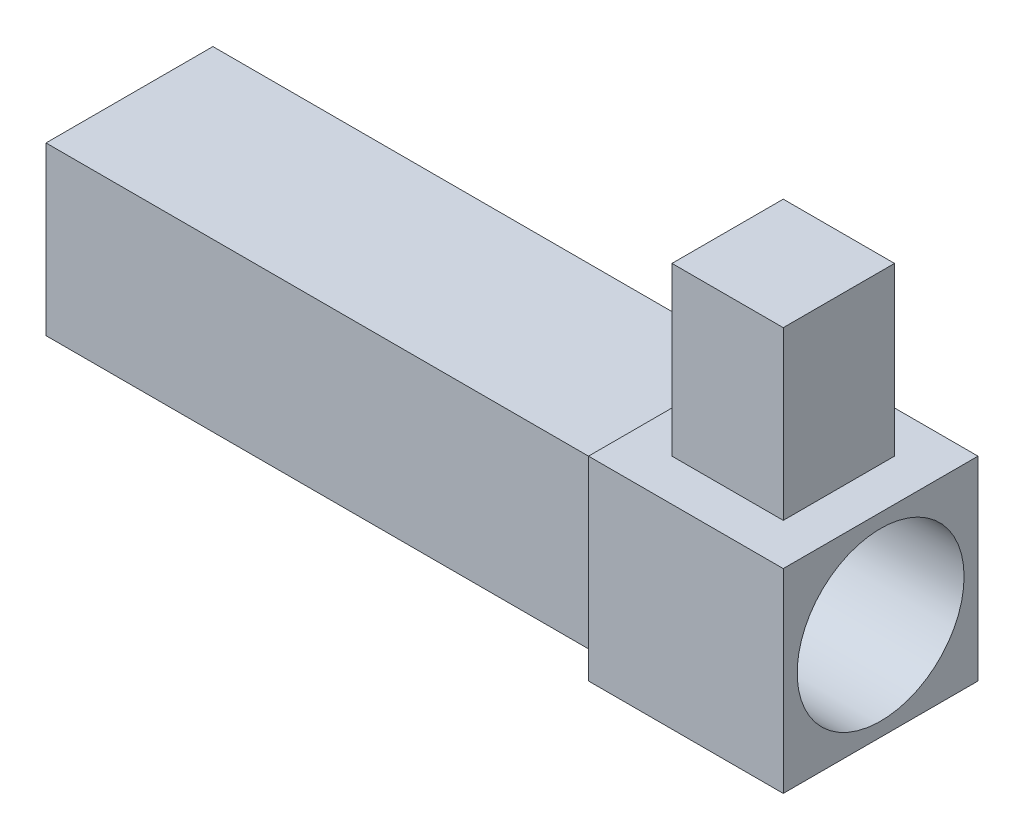
ISO-10303-21;
HEADER;
FILE_DESCRIPTION(('STEP AP214'),'2;1');
FILE_NAME('part.step','',(''),(''),'','','');
FILE_SCHEMA(('AUTOMOTIVE_DESIGN { 1 0 10303 214 1 1 1 1 }'));
ENDSEC;
DATA;
#1=APPLICATION_CONTEXT('core data for automotive mechanical design processes');
#2=APPLICATION_PROTOCOL_DEFINITION('international standard','automotive_design',2000,#1);
#3=PRODUCT_CONTEXT('',#1,'mechanical');
#4=PRODUCT('Part','Part','',(#3));
#5=PRODUCT_RELATED_PRODUCT_CATEGORY('part','',(#4));
#6=PRODUCT_DEFINITION_FORMATION('','',#4);
#7=PRODUCT_DEFINITION_CONTEXT('part definition',#1,'design');
#8=PRODUCT_DEFINITION('design','',#6,#7);
#9=PRODUCT_DEFINITION_SHAPE('','',#8);
#10=(LENGTH_UNIT() NAMED_UNIT(*) SI_UNIT(.MILLI.,.METRE.));
#11=(NAMED_UNIT(*) PLANE_ANGLE_UNIT() SI_UNIT($,.RADIAN.));
#12=(NAMED_UNIT(*) SI_UNIT($,.STERADIAN.) SOLID_ANGLE_UNIT());
#13=UNCERTAINTY_MEASURE_WITH_UNIT(LENGTH_MEASURE(1.E-05),#10,'distance_accuracy_value','');
#14=(GEOMETRIC_REPRESENTATION_CONTEXT(3) GLOBAL_UNCERTAINTY_ASSIGNED_CONTEXT((#13)) GLOBAL_UNIT_ASSIGNED_CONTEXT((#10,
#11,#12)) REPRESENTATION_CONTEXT('',''));
#15=CARTESIAN_POINT('',(0.,0.,0.));
#16=DIRECTION('',(0.,0.,1.));
#17=DIRECTION('',(1.,0.,0.));
#18=AXIS2_PLACEMENT_3D('',#15,#16,#17);
#19=CARTESIAN_POINT('',(135.,17.5,17.5));
#20=DIRECTION('',(0.,-1.,0.));
#21=DIRECTION('',(0.,0.,-1.));
#22=AXIS2_PLACEMENT_3D('',#19,#20,#21);
#23=PLANE('',#22);
#24=DIRECTION('',(0.,0.,1.));
#25=VECTOR('',#24,1.);
#26=CARTESIAN_POINT('',(100.,17.5,17.5));
#27=LINE('',#26,#25);
#28=CARTESIAN_POINT('',(100.,17.5,-17.5));
#29=VERTEX_POINT('',#28);
#30=CARTESIAN_POINT('',(100.,17.5,17.5));
#31=VERTEX_POINT('',#30);
#32=EDGE_CURVE('E173',#29,#31,#27,.T.);
#33=ORIENTED_EDGE('',*,*,#32,.T.);
#34=DIRECTION('',(-1.,0.,0.));
#35=VECTOR('',#34,1.);
#36=CARTESIAN_POINT('',(135.,17.5,17.5));
#37=LINE('',#36,#35);
#38=CARTESIAN_POINT('',(135.,17.5,17.5));
#39=VERTEX_POINT('',#38);
#40=EDGE_CURVE('E183',#39,#31,#37,.T.);
#41=ORIENTED_EDGE('',*,*,#40,.F.);
#42=DIRECTION('',(0.,0.,1.));
#43=VECTOR('',#42,1.);
#44=CARTESIAN_POINT('',(135.,17.5,17.5));
#45=LINE('',#44,#43);
#46=CARTESIAN_POINT('',(135.,17.5,-17.5));
#47=VERTEX_POINT('',#46);
#48=EDGE_CURVE('E163',#47,#39,#45,.T.);
#49=ORIENTED_EDGE('',*,*,#48,.F.);
#50=DIRECTION('',(-1.,0.,0.));
#51=VECTOR('',#50,1.);
#52=CARTESIAN_POINT('',(135.,17.5,-17.5));
#53=LINE('',#52,#51);
#54=EDGE_CURVE('E186',#47,#29,#53,.T.);
#55=ORIENTED_EDGE('',*,*,#54,.T.);
#56=EDGE_LOOP('',(#33,#41,#49,#55));
#57=FACE_BOUND('',#56,.T.);
#58=DIRECTION('',(0.,0.,-1.));
#59=VECTOR('',#58,1.);
#60=CARTESIAN_POINT('',(127.5,17.5,-10.));
#61=LINE('',#60,#59);
#62=CARTESIAN_POINT('',(127.5,17.5,9.99999999999999));
#63=VERTEX_POINT('',#62);
#64=CARTESIAN_POINT('',(127.5,17.5,-10.));
#65=VERTEX_POINT('',#64);
#66=EDGE_CURVE('E54',#63,#65,#61,.T.);
#67=ORIENTED_EDGE('',*,*,#66,.F.);
#68=DIRECTION('',(1.,0.,0.));
#69=VECTOR('',#68,1.);
#70=CARTESIAN_POINT('',(107.5,17.5,9.99999999999999));
#71=LINE('',#70,#69);
#72=CARTESIAN_POINT('',(107.5,17.5,9.99999999999999));
#73=VERTEX_POINT('',#72);
#74=EDGE_CURVE('E58',#73,#63,#71,.T.);
#75=ORIENTED_EDGE('',*,*,#74,.F.);
#76=DIRECTION('',(0.,0.,1.));
#77=VECTOR('',#76,1.);
#78=CARTESIAN_POINT('',(107.5,17.5,-10.));
#79=LINE('',#78,#77);
#80=CARTESIAN_POINT('',(107.5,17.5,-10.));
#81=VERTEX_POINT('',#80);
#82=EDGE_CURVE('E371',#81,#73,#79,.T.);
#83=ORIENTED_EDGE('',*,*,#82,.F.);
#84=DIRECTION('',(-1.,0.,0.));
#85=VECTOR('',#84,1.);
#86=CARTESIAN_POINT('',(107.5,17.5,-10.));
#87=LINE('',#86,#85);
#88=EDGE_CURVE('E377',#65,#81,#87,.T.);
#89=ORIENTED_EDGE('',*,*,#88,.F.);
#90=EDGE_LOOP('',(#67,#75,#83,#89));
#91=FACE_BOUND('',#90,.T.);
#92=ADVANCED_FACE('F39',(#57,#91),#23,.F.);
#93=CARTESIAN_POINT('',(100.,15.,-15.));
#94=DIRECTION('',(0.,0.,1.));
#95=DIRECTION('',(0.,-1.,0.));
#96=AXIS2_PLACEMENT_3D('',#93,#94,#95);
#97=PLANE('',#96);
#98=DIRECTION('',(0.,1.,0.));
#99=VECTOR('',#98,1.);
#100=CARTESIAN_POINT('',(0.,15.,-15.));
#101=LINE('',#100,#99);
#102=CARTESIAN_POINT('',(0.,-15.,-15.));
#103=VERTEX_POINT('',#102);
#104=CARTESIAN_POINT('',(0.,15.,-15.));
#105=VERTEX_POINT('',#104);
#106=EDGE_CURVE('E189',#103,#105,#101,.T.);
#107=ORIENTED_EDGE('',*,*,#106,.T.);
#108=DIRECTION('',(-1.,0.,0.));
#109=VECTOR('',#108,1.);
#110=CARTESIAN_POINT('',(100.,15.,-15.));
#111=LINE('',#110,#109);
#112=CARTESIAN_POINT('',(100.,15.,-15.));
#113=VERTEX_POINT('',#112);
#114=EDGE_CURVE('E11',#113,#105,#111,.T.);
#115=ORIENTED_EDGE('',*,*,#114,.F.);
#116=DIRECTION('',(0.,1.,0.));
#117=VECTOR('',#116,1.);
#118=CARTESIAN_POINT('',(100.,15.,-15.));
#119=LINE('',#118,#117);
#120=CARTESIAN_POINT('',(100.,-15.,-15.));
#121=VERTEX_POINT('',#120);
#122=EDGE_CURVE('E190',#121,#113,#119,.T.);
#123=ORIENTED_EDGE('',*,*,#122,.F.);
#124=DIRECTION('',(-1.,0.,0.));
#125=VECTOR('',#124,1.);
#126=CARTESIAN_POINT('',(100.,-15.,-15.));
#127=LINE('',#126,#125);
#128=EDGE_CURVE('E203',#121,#103,#127,.T.);
#129=ORIENTED_EDGE('',*,*,#128,.T.);
#130=EDGE_LOOP('',(#107,#115,#123,#129));
#131=FACE_BOUND('',#130,.T.);
#132=ADVANCED_FACE('F41',(#131),#97,.F.);
#133=CARTESIAN_POINT('',(100.,15.,15.));
#134=DIRECTION('',(0.,-1.,0.));
#135=DIRECTION('',(0.,0.,-1.));
#136=AXIS2_PLACEMENT_3D('',#133,#134,#135);
#137=PLANE('',#136);
#138=DIRECTION('',(0.,0.,1.));
#139=VECTOR('',#138,1.);
#140=CARTESIAN_POINT('',(0.,15.,15.));
#141=LINE('',#140,#139);
#142=CARTESIAN_POINT('',(0.,15.,15.));
#143=VERTEX_POINT('',#142);
#144=EDGE_CURVE('E206',#105,#143,#141,.T.);
#145=ORIENTED_EDGE('',*,*,#144,.T.);
#146=DIRECTION('',(-1.,0.,0.));
#147=VECTOR('',#146,1.);
#148=CARTESIAN_POINT('',(100.,15.,15.));
#149=LINE('',#148,#147);
#150=CARTESIAN_POINT('',(100.,15.,15.));
#151=VERTEX_POINT('',#150);
#152=EDGE_CURVE('E47',#151,#143,#149,.T.);
#153=ORIENTED_EDGE('',*,*,#152,.F.);
#154=DIRECTION('',(0.,0.,1.));
#155=VECTOR('',#154,1.);
#156=CARTESIAN_POINT('',(100.,15.,15.));
#157=LINE('',#156,#155);
#158=EDGE_CURVE('E193',#113,#151,#157,.T.);
#159=ORIENTED_EDGE('',*,*,#158,.F.);
#160=ORIENTED_EDGE('',*,*,#114,.T.);
#161=EDGE_LOOP('',(#145,#153,#159,#160));
#162=FACE_BOUND('',#161,.T.);
#163=ADVANCED_FACE('F233',(#162),#137,.F.);
#164=CARTESIAN_POINT('',(100.,15.,15.));
#165=DIRECTION('',(0.,0.,-1.));
#166=DIRECTION('',(0.,1.,0.));
#167=AXIS2_PLACEMENT_3D('',#164,#165,#166);
#168=PLANE('',#167);
#169=DIRECTION('',(0.,-1.,0.));
#170=VECTOR('',#169,1.);
#171=CARTESIAN_POINT('',(0.,15.,15.));
#172=LINE('',#171,#170);
#173=CARTESIAN_POINT('',(0.,-15.,15.));
#174=VERTEX_POINT('',#173);
#175=EDGE_CURVE('E208',#143,#174,#172,.T.);
#176=ORIENTED_EDGE('',*,*,#175,.T.);
#177=DIRECTION('',(-1.,0.,0.));
#178=VECTOR('',#177,1.);
#179=CARTESIAN_POINT('',(100.,-15.,15.));
#180=LINE('',#179,#178);
#181=CARTESIAN_POINT('',(100.,-15.,15.));
#182=VERTEX_POINT('',#181);
#183=EDGE_CURVE('E213',#182,#174,#180,.T.);
#184=ORIENTED_EDGE('',*,*,#183,.F.);
#185=DIRECTION('',(0.,-1.,0.));
#186=VECTOR('',#185,1.);
#187=CARTESIAN_POINT('',(100.,15.,15.));
#188=LINE('',#187,#186);
#189=EDGE_CURVE('E197',#151,#182,#188,.T.);
#190=ORIENTED_EDGE('',*,*,#189,.F.);
#191=ORIENTED_EDGE('',*,*,#152,.T.);
#192=EDGE_LOOP('',(#176,#184,#190,#191));
#193=FACE_BOUND('',#192,.T.);
#194=ADVANCED_FACE('F219',(#193),#168,.F.);
#195=CARTESIAN_POINT('',(100.,-15.,15.));
#196=DIRECTION('',(0.,1.,0.));
#197=DIRECTION('',(0.,0.,1.));
#198=AXIS2_PLACEMENT_3D('',#195,#196,#197);
#199=PLANE('',#198);
#200=DIRECTION('',(0.,0.,-1.));
#201=VECTOR('',#200,1.);
#202=CARTESIAN_POINT('',(0.,-15.,15.));
#203=LINE('',#202,#201);
#204=EDGE_CURVE('E194',#174,#103,#203,.T.);
#205=ORIENTED_EDGE('',*,*,#204,.T.);
#206=ORIENTED_EDGE('',*,*,#128,.F.);
#207=DIRECTION('',(0.,0.,-1.));
#208=VECTOR('',#207,1.);
#209=CARTESIAN_POINT('',(100.,-15.,15.));
#210=LINE('',#209,#208);
#211=EDGE_CURVE('E200',#182,#121,#210,.T.);
#212=ORIENTED_EDGE('',*,*,#211,.F.);
#213=ORIENTED_EDGE('',*,*,#183,.T.);
#214=EDGE_LOOP('',(#205,#206,#212,#213));
#215=FACE_BOUND('',#214,.T.);
#216=ADVANCED_FACE('F227',(#215),#199,.F.);
#217=CARTESIAN_POINT('',(0.,0.,0.));
#218=DIRECTION('',(1.,0.,0.));
#219=DIRECTION('',(0.,0.,-1.));
#220=AXIS2_PLACEMENT_3D('',#217,#218,#219);
#221=PLANE('',#220);
#222=ORIENTED_EDGE('',*,*,#106,.F.);
#223=ORIENTED_EDGE('',*,*,#204,.F.);
#224=ORIENTED_EDGE('',*,*,#175,.F.);
#225=ORIENTED_EDGE('',*,*,#144,.F.);
#226=EDGE_LOOP('',(#222,#223,#224,#225));
#227=FACE_BOUND('',#226,.T.);
#228=ADVANCED_FACE('F224',(#227),#221,.F.);
#229=CARTESIAN_POINT('',(100.,0.,0.));
#230=DIRECTION('',(1.,0.,0.));
#231=DIRECTION('',(0.,0.,-1.));
#232=AXIS2_PLACEMENT_3D('',#229,#230,#231);
#233=PLANE('',#232);
#234=DIRECTION('',(0.,1.,0.));
#235=VECTOR('',#234,1.);
#236=CARTESIAN_POINT('',(100.,17.5,-17.5));
#237=LINE('',#236,#235);
#238=CARTESIAN_POINT('',(100.,-17.5,-17.5));
#239=VERTEX_POINT('',#238);
#240=EDGE_CURVE('E158',#239,#29,#237,.T.);
#241=ORIENTED_EDGE('',*,*,#240,.F.);
#242=DIRECTION('',(0.,0.,-1.));
#243=VECTOR('',#242,1.);
#244=CARTESIAN_POINT('',(100.,-17.5,17.5));
#245=LINE('',#244,#243);
#246=CARTESIAN_POINT('',(100.,-17.5,17.5));
#247=VERTEX_POINT('',#246);
#248=EDGE_CURVE('E164',#247,#239,#245,.T.);
#249=ORIENTED_EDGE('',*,*,#248,.F.);
#250=DIRECTION('',(0.,-1.,0.));
#251=VECTOR('',#250,1.);
#252=CARTESIAN_POINT('',(100.,17.5,17.5));
#253=LINE('',#252,#251);
#254=EDGE_CURVE('E175',#31,#247,#253,.T.);
#255=ORIENTED_EDGE('',*,*,#254,.F.);
#256=ORIENTED_EDGE('',*,*,#32,.F.);
#257=EDGE_LOOP('',(#241,#249,#255,#256));
#258=FACE_BOUND('',#257,.T.);
#259=ORIENTED_EDGE('',*,*,#211,.T.);
#260=ORIENTED_EDGE('',*,*,#122,.T.);
#261=ORIENTED_EDGE('',*,*,#158,.T.);
#262=ORIENTED_EDGE('',*,*,#189,.T.);
#263=EDGE_LOOP('',(#259,#260,#261,#262));
#264=FACE_BOUND('',#263,.T.);
#265=ADVANCED_FACE('F232',(#258,#264),#233,.F.);
#266=CARTESIAN_POINT('',(135.,17.5,-17.5));
#267=DIRECTION('',(0.,0.,1.));
#268=DIRECTION('',(0.,-1.,0.));
#269=AXIS2_PLACEMENT_3D('',#266,#267,#268);
#270=PLANE('',#269);
#271=ORIENTED_EDGE('',*,*,#240,.T.);
#272=ORIENTED_EDGE('',*,*,#54,.F.);
#273=DIRECTION('',(0.,1.,0.));
#274=VECTOR('',#273,1.);
#275=CARTESIAN_POINT('',(135.,17.5,-17.5));
#276=LINE('',#275,#274);
#277=CARTESIAN_POINT('',(135.,-17.5,-17.5));
#278=VERTEX_POINT('',#277);
#279=EDGE_CURVE('E160',#278,#47,#276,.T.);
#280=ORIENTED_EDGE('',*,*,#279,.F.);
#281=DIRECTION('',(-1.,0.,0.));
#282=VECTOR('',#281,1.);
#283=CARTESIAN_POINT('',(135.,-17.5,-17.5));
#284=LINE('',#283,#282);
#285=EDGE_CURVE('E170',#278,#239,#284,.T.);
#286=ORIENTED_EDGE('',*,*,#285,.T.);
#287=EDGE_LOOP('',(#271,#272,#280,#286));
#288=FACE_BOUND('',#287,.T.);
#289=ADVANCED_FACE('F251',(#288),#270,.F.);
#290=CARTESIAN_POINT('',(135.,17.5,17.5));
#291=DIRECTION('',(0.,0.,-1.));
#292=DIRECTION('',(0.,1.,0.));
#293=AXIS2_PLACEMENT_3D('',#290,#291,#292);
#294=PLANE('',#293);
#295=ORIENTED_EDGE('',*,*,#254,.T.);
#296=DIRECTION('',(-1.,0.,0.));
#297=VECTOR('',#296,1.);
#298=CARTESIAN_POINT('',(135.,-17.5,17.5));
#299=LINE('',#298,#297);
#300=CARTESIAN_POINT('',(135.,-17.5,17.5));
#301=VERTEX_POINT('',#300);
#302=EDGE_CURVE('E180',#301,#247,#299,.T.);
#303=ORIENTED_EDGE('',*,*,#302,.F.);
#304=DIRECTION('',(0.,-1.,0.));
#305=VECTOR('',#304,1.);
#306=CARTESIAN_POINT('',(135.,17.5,17.5));
#307=LINE('',#306,#305);
#308=EDGE_CURVE('E166',#39,#301,#307,.T.);
#309=ORIENTED_EDGE('',*,*,#308,.F.);
#310=ORIENTED_EDGE('',*,*,#40,.T.);
#311=EDGE_LOOP('',(#295,#303,#309,#310));
#312=FACE_BOUND('',#311,.T.);
#313=ADVANCED_FACE('F249',(#312),#294,.F.);
#314=CARTESIAN_POINT('',(135.,-17.5,17.5));
#315=DIRECTION('',(0.,1.,0.));
#316=DIRECTION('',(0.,0.,1.));
#317=AXIS2_PLACEMENT_3D('',#314,#315,#316);
#318=PLANE('',#317);
#319=ORIENTED_EDGE('',*,*,#248,.T.);
#320=ORIENTED_EDGE('',*,*,#285,.F.);
#321=DIRECTION('',(0.,0.,-1.));
#322=VECTOR('',#321,1.);
#323=CARTESIAN_POINT('',(135.,-17.5,17.5));
#324=LINE('',#323,#322);
#325=EDGE_CURVE('E168',#301,#278,#324,.T.);
#326=ORIENTED_EDGE('',*,*,#325,.F.);
#327=ORIENTED_EDGE('',*,*,#302,.T.);
#328=EDGE_LOOP('',(#319,#320,#326,#327));
#329=FACE_BOUND('',#328,.T.);
#330=ADVANCED_FACE('F283',(#329),#318,.F.);
#331=CARTESIAN_POINT('',(135.,0.,0.));
#332=DIRECTION('',(1.,0.,0.));
#333=DIRECTION('',(0.,0.,-1.));
#334=AXIS2_PLACEMENT_3D('',#331,#332,#333);
#335=PLANE('',#334);
#336=CARTESIAN_POINT('',(135.,0.,0.));
#337=DIRECTION('',(1.,0.,0.));
#338=DIRECTION('',(0.,0.,-1.));
#339=AXIS2_PLACEMENT_3D('',#336,#337,#338);
#340=CIRCLE('',#339,15.);
#341=CARTESIAN_POINT('',(135.,0.,-15.));
#342=VERTEX_POINT('',#341);
#343=EDGE_CURVE('E148',#342,#342,#340,.T.);
#344=ORIENTED_EDGE('',*,*,#343,.F.);
#345=EDGE_LOOP('',(#344));
#346=FACE_BOUND('',#345,.T.);
#347=ORIENTED_EDGE('',*,*,#279,.T.);
#348=ORIENTED_EDGE('',*,*,#48,.T.);
#349=ORIENTED_EDGE('',*,*,#308,.T.);
#350=ORIENTED_EDGE('',*,*,#325,.T.);
#351=EDGE_LOOP('',(#347,#348,#349,#350));
#352=FACE_BOUND('',#351,.T.);
#353=ADVANCED_FACE('F291',(#346,#352),#335,.T.);
#354=CARTESIAN_POINT('',(105.,0.,0.));
#355=DIRECTION('',(1.,0.,0.));
#356=DIRECTION('',(0.,0.,-1.));
#357=AXIS2_PLACEMENT_3D('',#354,#355,#356);
#358=CYLINDRICAL_SURFACE('',#357,15.);
#359=CARTESIAN_POINT('',(105.,0.,0.));
#360=DIRECTION('',(1.,0.,0.));
#361=DIRECTION('',(0.,0.,-1.));
#362=AXIS2_PLACEMENT_3D('',#359,#360,#361);
#363=CIRCLE('',#362,15.);
#364=CARTESIAN_POINT('',(105.,0.,-15.));
#365=VERTEX_POINT('',#364);
#366=EDGE_CURVE('E151',#365,#365,#363,.T.);
#367=ORIENTED_EDGE('',*,*,#366,.F.);
#368=EDGE_LOOP('',(#367));
#369=FACE_BOUND('',#368,.T.);
#370=ORIENTED_EDGE('',*,*,#343,.T.);
#371=EDGE_LOOP('',(#370));
#372=FACE_BOUND('',#371,.T.);
#373=ADVANCED_FACE('F299',(#369,#372),#358,.F.);
#374=CARTESIAN_POINT('',(105.,0.,0.));
#375=DIRECTION('',(1.,0.,0.));
#376=DIRECTION('',(0.,0.,-1.));
#377=AXIS2_PLACEMENT_3D('',#374,#375,#376);
#378=PLANE('',#377);
#379=ORIENTED_EDGE('',*,*,#366,.T.);
#380=EDGE_LOOP('',(#379));
#381=FACE_BOUND('',#380,.T.);
#382=ADVANCED_FACE('F307',(#381),#378,.T.);
#383=CARTESIAN_POINT('',(127.5,47.5,-10.));
#384=DIRECTION('',(-1.,0.,0.));
#385=DIRECTION('',(0.,0.,1.));
#386=AXIS2_PLACEMENT_3D('',#383,#384,#385);
#387=PLANE('',#386);
#388=ORIENTED_EDGE('',*,*,#66,.T.);
#389=DIRECTION('',(0.,-1.,0.));
#390=VECTOR('',#389,1.);
#391=CARTESIAN_POINT('',(127.5,47.5,-10.));
#392=LINE('',#391,#390);
#393=CARTESIAN_POINT('',(127.5,47.5,-10.));
#394=VERTEX_POINT('',#393);
#395=EDGE_CURVE('E131',#394,#65,#392,.T.);
#396=ORIENTED_EDGE('',*,*,#395,.F.);
#397=DIRECTION('',(0.,0.,-1.));
#398=VECTOR('',#397,1.);
#399=CARTESIAN_POINT('',(127.5,47.5,-10.));
#400=LINE('',#399,#398);
#401=CARTESIAN_POINT('',(127.5,47.5,9.99999999999999));
#402=VERTEX_POINT('',#401);
#403=EDGE_CURVE('E137',#402,#394,#400,.T.);
#404=ORIENTED_EDGE('',*,*,#403,.F.);
#405=DIRECTION('',(0.,-1.,0.));
#406=VECTOR('',#405,1.);
#407=CARTESIAN_POINT('',(127.5,47.5,9.99999999999999));
#408=LINE('',#407,#406);
#409=EDGE_CURVE('E369',#402,#63,#408,.T.);
#410=ORIENTED_EDGE('',*,*,#409,.T.);
#411=EDGE_LOOP('',(#388,#396,#404,#410));
#412=FACE_BOUND('',#411,.T.);
#413=ADVANCED_FACE('F147',(#412),#387,.F.);
#414=CARTESIAN_POINT('',(107.5,47.5,-10.));
#415=DIRECTION('',(0.,0.,1.));
#416=DIRECTION('',(1.,0.,0.));
#417=AXIS2_PLACEMENT_3D('',#414,#415,#416);
#418=PLANE('',#417);
#419=ORIENTED_EDGE('',*,*,#88,.T.);
#420=DIRECTION('',(0.,-1.,0.));
#421=VECTOR('',#420,1.);
#422=CARTESIAN_POINT('',(107.5,47.5,-10.));
#423=LINE('',#422,#421);
#424=CARTESIAN_POINT('',(107.5,47.5,-10.));
#425=VERTEX_POINT('',#424);
#426=EDGE_CURVE('E133',#425,#81,#423,.T.);
#427=ORIENTED_EDGE('',*,*,#426,.F.);
#428=DIRECTION('',(-1.,0.,0.));
#429=VECTOR('',#428,1.);
#430=CARTESIAN_POINT('',(107.5,47.5,-10.));
#431=LINE('',#430,#429);
#432=EDGE_CURVE('E126',#394,#425,#431,.T.);
#433=ORIENTED_EDGE('',*,*,#432,.F.);
#434=ORIENTED_EDGE('',*,*,#395,.T.);
#435=EDGE_LOOP('',(#419,#427,#433,#434));
#436=FACE_BOUND('',#435,.T.);
#437=ADVANCED_FACE('F129',(#436),#418,.F.);
#438=CARTESIAN_POINT('',(107.5,47.5,-10.));
#439=DIRECTION('',(1.,0.,0.));
#440=DIRECTION('',(0.,0.,-1.));
#441=AXIS2_PLACEMENT_3D('',#438,#439,#440);
#442=PLANE('',#441);
#443=ORIENTED_EDGE('',*,*,#82,.T.);
#444=DIRECTION('',(0.,-1.,0.));
#445=VECTOR('',#444,1.);
#446=CARTESIAN_POINT('',(107.5,47.5,9.99999999999999));
#447=LINE('',#446,#445);
#448=CARTESIAN_POINT('',(107.5,47.5,9.99999999999999));
#449=VERTEX_POINT('',#448);
#450=EDGE_CURVE('E153',#449,#73,#447,.T.);
#451=ORIENTED_EDGE('',*,*,#450,.F.);
#452=DIRECTION('',(0.,0.,1.));
#453=VECTOR('',#452,1.);
#454=CARTESIAN_POINT('',(107.5,47.5,-10.));
#455=LINE('',#454,#453);
#456=EDGE_CURVE('E136',#425,#449,#455,.T.);
#457=ORIENTED_EDGE('',*,*,#456,.F.);
#458=ORIENTED_EDGE('',*,*,#426,.T.);
#459=EDGE_LOOP('',(#443,#451,#457,#458));
#460=FACE_BOUND('',#459,.T.);
#461=ADVANCED_FACE('F338',(#460),#442,.F.);
#462=CARTESIAN_POINT('',(107.5,47.5,9.99999999999999));
#463=DIRECTION('',(0.,0.,-1.));
#464=DIRECTION('',(-1.,0.,0.));
#465=AXIS2_PLACEMENT_3D('',#462,#463,#464);
#466=PLANE('',#465);
#467=ORIENTED_EDGE('',*,*,#74,.T.);
#468=ORIENTED_EDGE('',*,*,#409,.F.);
#469=DIRECTION('',(1.,0.,0.));
#470=VECTOR('',#469,1.);
#471=CARTESIAN_POINT('',(107.5,47.5,9.99999999999999));
#472=LINE('',#471,#470);
#473=EDGE_CURVE('E142',#449,#402,#472,.T.);
#474=ORIENTED_EDGE('',*,*,#473,.F.);
#475=ORIENTED_EDGE('',*,*,#450,.T.);
#476=EDGE_LOOP('',(#467,#468,#474,#475));
#477=FACE_BOUND('',#476,.T.);
#478=ADVANCED_FACE('F347',(#477),#466,.F.);
#479=CARTESIAN_POINT('',(0.,47.5,0.));
#480=DIRECTION('',(0.,1.,0.));
#481=DIRECTION('',(0.,0.,1.));
#482=AXIS2_PLACEMENT_3D('',#479,#480,#481);
#483=PLANE('',#482);
#484=ORIENTED_EDGE('',*,*,#403,.T.);
#485=ORIENTED_EDGE('',*,*,#432,.T.);
#486=ORIENTED_EDGE('',*,*,#456,.T.);
#487=ORIENTED_EDGE('',*,*,#473,.T.);
#488=EDGE_LOOP('',(#484,#485,#486,#487));
#489=FACE_BOUND('',#488,.T.);
#490=ADVANCED_FACE('F140',(#489),#483,.T.);
#491=CLOSED_SHELL('',(#92,#132,#163,#194,#216,#228,#265,#289,#313,#330,#353,#373,#382,#413,#437,
#461,#478,#490));
#492=MANIFOLD_SOLID_BREP('B2',#491);
#493=ADVANCED_BREP_SHAPE_REPRESENTATION('',(#18,#492),#14);
#494=SHAPE_DEFINITION_REPRESENTATION(#9,#493);
ENDSEC;
END-ISO-10303-21;
